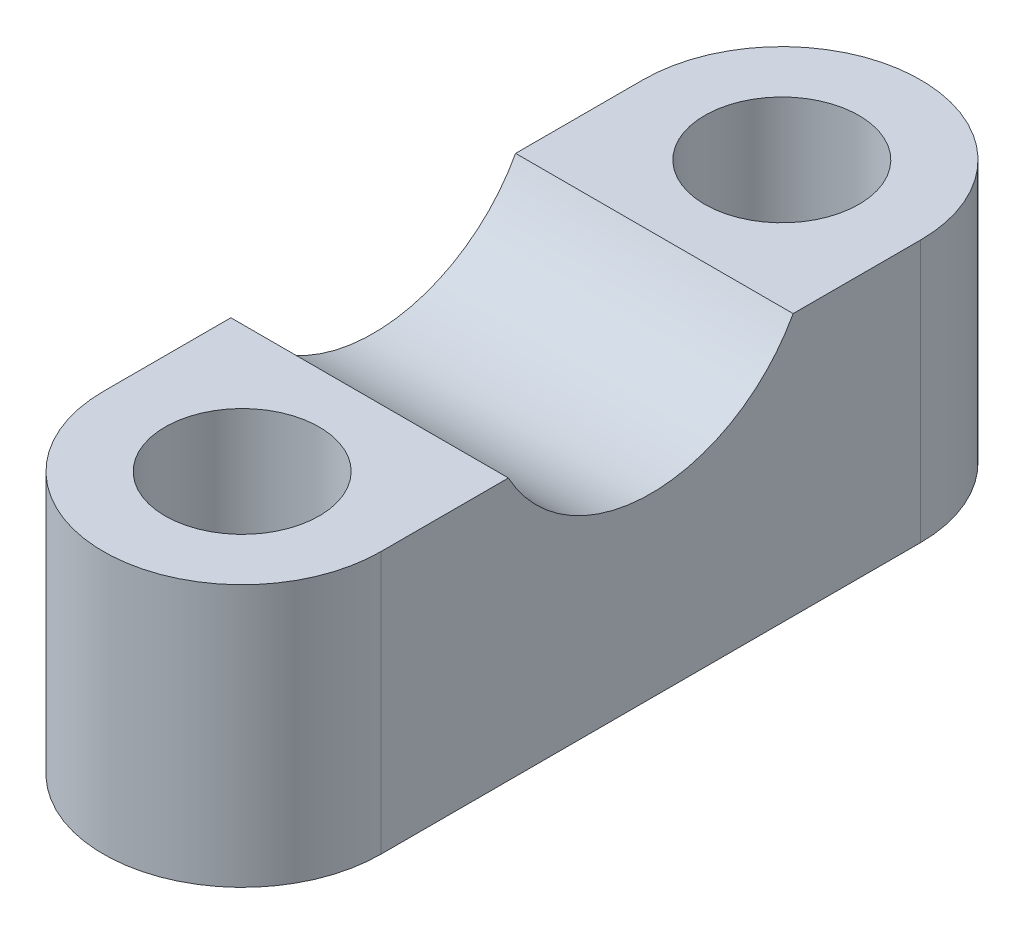
ISO-10303-21;
HEADER;
FILE_DESCRIPTION(('STEP AP214'),'2;1');
FILE_NAME('part.step','',(''),(''),'','','');
FILE_SCHEMA(('AUTOMOTIVE_DESIGN { 1 0 10303 214 1 1 1 1 }'));
ENDSEC;
DATA;
#1=APPLICATION_CONTEXT('core data for automotive mechanical design processes');
#2=APPLICATION_PROTOCOL_DEFINITION('international standard','automotive_design',2000,#1);
#3=PRODUCT_CONTEXT('',#1,'mechanical');
#4=PRODUCT('Part','Part','',(#3));
#5=PRODUCT_RELATED_PRODUCT_CATEGORY('part','',(#4));
#6=PRODUCT_DEFINITION_FORMATION('','',#4);
#7=PRODUCT_DEFINITION_CONTEXT('part definition',#1,'design');
#8=PRODUCT_DEFINITION('design','',#6,#7);
#9=PRODUCT_DEFINITION_SHAPE('','',#8);
#10=(LENGTH_UNIT() NAMED_UNIT(*) SI_UNIT(.MILLI.,.METRE.));
#11=(NAMED_UNIT(*) PLANE_ANGLE_UNIT() SI_UNIT($,.RADIAN.));
#12=(NAMED_UNIT(*) SI_UNIT($,.STERADIAN.) SOLID_ANGLE_UNIT());
#13=UNCERTAINTY_MEASURE_WITH_UNIT(LENGTH_MEASURE(1.E-05),#10,'distance_accuracy_value','');
#14=(GEOMETRIC_REPRESENTATION_CONTEXT(3) GLOBAL_UNCERTAINTY_ASSIGNED_CONTEXT((#13)) GLOBAL_UNIT_ASSIGNED_CONTEXT((#10,
#11,#12)) REPRESENTATION_CONTEXT('',''));
#15=CARTESIAN_POINT('',(0.,0.,0.));
#16=DIRECTION('',(0.,0.,1.));
#17=DIRECTION('',(1.,0.,0.));
#18=AXIS2_PLACEMENT_3D('',#15,#16,#17);
#19=CARTESIAN_POINT('',(-47.,17.,0.));
#20=DIRECTION('',(0.,1.,0.));
#21=DIRECTION('',(0.,0.,1.));
#22=AXIS2_PLACEMENT_3D('',#19,#20,#21);
#23=PLANE('',#22);
#24=DIRECTION('',(1.,0.,0.));
#25=VECTOR('',#24,1.);
#26=CARTESIAN_POINT('',(-64.,17.,-8.26690734369031));
#27=LINE('',#26,#25);
#28=CARTESIAN_POINT('',(-56.,17.,-8.26690734369031));
#29=VERTEX_POINT('',#28);
#30=CARTESIAN_POINT('',(-38.,17.,-8.26690734369031));
#31=VERTEX_POINT('',#30);
#32=EDGE_CURVE('E150',#29,#31,#27,.T.);
#33=ORIENTED_EDGE('',*,*,#32,.F.);
#34=DIRECTION('',(0.,0.,1.));
#35=VECTOR('',#34,1.);
#36=CARTESIAN_POINT('',(-56.,17.,0.));
#37=LINE('',#36,#35);
#38=CARTESIAN_POINT('',(-56.,17.,0.));
#39=VERTEX_POINT('',#38);
#40=EDGE_CURVE('E178',#29,#39,#37,.T.);
#41=ORIENTED_EDGE('',*,*,#40,.T.);
#42=CARTESIAN_POINT('',(-47.,17.,0.));
#43=DIRECTION('',(0.,1.,0.));
#44=DIRECTION('',(0.,0.,1.));
#45=AXIS2_PLACEMENT_3D('',#42,#43,#44);
#46=CIRCLE('',#45,9.);
#47=CARTESIAN_POINT('',(-38.,17.,0.));
#48=VERTEX_POINT('',#47);
#49=EDGE_CURVE('E168',#39,#48,#46,.T.);
#50=ORIENTED_EDGE('',*,*,#49,.T.);
#51=DIRECTION('',(0.,0.,-1.));
#52=VECTOR('',#51,1.);
#53=CARTESIAN_POINT('',(-38.,17.,0.));
#54=LINE('',#53,#52);
#55=EDGE_CURVE('E173',#48,#31,#54,.T.);
#56=ORIENTED_EDGE('',*,*,#55,.T.);
#57=EDGE_LOOP('',(#33,#41,#50,#56));
#58=FACE_BOUND('',#57,.T.);
#59=CARTESIAN_POINT('',(-47.,17.,0.));
#60=DIRECTION('',(0.,1.,0.));
#61=DIRECTION('',(0.,0.,1.));
#62=AXIS2_PLACEMENT_3D('',#59,#60,#61);
#63=CIRCLE('',#62,5.);
#64=CARTESIAN_POINT('',(-47.,17.,5.));
#65=VERTEX_POINT('',#64);
#66=EDGE_CURVE('E156',#65,#65,#63,.T.);
#67=ORIENTED_EDGE('',*,*,#66,.F.);
#68=EDGE_LOOP('',(#67));
#69=FACE_BOUND('',#68,.T.);
#70=ADVANCED_FACE('F35',(#58,#69),#23,.T.);
#71=DIRECTION('',(1.,0.,0.));
#72=VECTOR('',#71,1.);
#73=CARTESIAN_POINT('',(-64.,17.,-26.7330926563097));
#74=LINE('',#73,#72);
#75=CARTESIAN_POINT('',(-38.,17.,-26.7330926563097));
#76=VERTEX_POINT('',#75);
#77=CARTESIAN_POINT('',(-56.0000000000001,17.,-26.7330926563097));
#78=VERTEX_POINT('',#77);
#79=EDGE_CURVE('E58',#76,#78,#74,.F.);
#80=ORIENTED_EDGE('',*,*,#79,.F.);
#81=CARTESIAN_POINT('',(-38.0000000000001,17.,-35.));
#82=VERTEX_POINT('',#81);
#83=EDGE_CURVE('E171',#76,#82,#54,.T.);
#84=ORIENTED_EDGE('',*,*,#83,.T.);
#85=CARTESIAN_POINT('',(-47.0000000000001,17.,-35.));
#86=DIRECTION('',(0.,1.,0.));
#87=DIRECTION('',(0.,0.,1.));
#88=AXIS2_PLACEMENT_3D('',#85,#86,#87);
#89=CIRCLE('',#88,9.);
#90=CARTESIAN_POINT('',(-56.0000000000001,17.,-35.));
#91=VERTEX_POINT('',#90);
#92=EDGE_CURVE('E176',#82,#91,#89,.T.);
#93=ORIENTED_EDGE('',*,*,#92,.T.);
#94=EDGE_CURVE('E179',#91,#78,#37,.T.);
#95=ORIENTED_EDGE('',*,*,#94,.T.);
#96=EDGE_LOOP('',(#80,#84,#93,#95));
#97=FACE_BOUND('',#96,.T.);
#98=CARTESIAN_POINT('',(-47.0000000000001,17.,-35.));
#99=DIRECTION('',(0.,1.,0.));
#100=DIRECTION('',(0.,0.,1.));
#101=AXIS2_PLACEMENT_3D('',#98,#99,#100);
#102=CIRCLE('',#101,5.);
#103=CARTESIAN_POINT('',(-47.0000000000001,17.,-30.));
#104=VERTEX_POINT('',#103);
#105=EDGE_CURVE('E162',#104,#104,#102,.T.);
#106=ORIENTED_EDGE('',*,*,#105,.F.);
#107=EDGE_LOOP('',(#106));
#108=FACE_BOUND('',#107,.T.);
#109=ADVANCED_FACE('F221',(#97,#108),#23,.T.);
#110=CARTESIAN_POINT('',(-47.,0.,0.));
#111=DIRECTION('',(0.,1.,0.));
#112=DIRECTION('',(0.,0.,1.));
#113=AXIS2_PLACEMENT_3D('',#110,#111,#112);
#114=PLANE('',#113);
#115=DIRECTION('',(0.,0.,1.));
#116=VECTOR('',#115,1.);
#117=CARTESIAN_POINT('',(-41.9999999999999,0.,-7.48331477354782));
#118=LINE('',#117,#116);
#119=CARTESIAN_POINT('',(-42.0000000000001,0.,-27.5166852264521));
#120=VERTEX_POINT('',#119);
#121=CARTESIAN_POINT('',(-41.9999999999999,0.,-7.48331477354783));
#122=VERTEX_POINT('',#121);
#123=EDGE_CURVE('E140',#120,#122,#118,.T.);
#124=ORIENTED_EDGE('',*,*,#123,.F.);
#125=CARTESIAN_POINT('',(-47.0000000000001,0.,-35.));
#126=DIRECTION('',(0.,1.,0.));
#127=DIRECTION('',(0.,0.,-1.));
#128=AXIS2_PLACEMENT_3D('',#125,#126,#127);
#129=CIRCLE('',#128,9.00000000000001);
#130=CARTESIAN_POINT('',(-52.0000000000001,0.,-27.5166852264521));
#131=VERTEX_POINT('',#130);
#132=EDGE_CURVE('E50',#131,#120,#129,.T.);
#133=ORIENTED_EDGE('',*,*,#132,.F.);
#134=DIRECTION('',(0.,0.,-1.));
#135=VECTOR('',#134,1.);
#136=CARTESIAN_POINT('',(-52.0000000000001,0.,-7.4833147735478));
#137=LINE('',#136,#135);
#138=CARTESIAN_POINT('',(-52.0000000000001,0.,-7.4833147735478));
#139=VERTEX_POINT('',#138);
#140=EDGE_CURVE('E131',#139,#131,#137,.T.);
#141=ORIENTED_EDGE('',*,*,#140,.F.);
#142=CARTESIAN_POINT('',(-47.,0.,0.));
#143=DIRECTION('',(0.,1.,0.));
#144=DIRECTION('',(0.,0.,-1.));
#145=AXIS2_PLACEMENT_3D('',#142,#143,#144);
#146=CIRCLE('',#145,9.);
#147=EDGE_CURVE('E134',#122,#139,#146,.T.);
#148=ORIENTED_EDGE('',*,*,#147,.F.);
#149=EDGE_LOOP('',(#124,#133,#141,#148));
#150=FACE_BOUND('',#149,.T.);
#151=CARTESIAN_POINT('',(-47.,0.,0.));
#152=DIRECTION('',(0.,1.,0.));
#153=DIRECTION('',(0.,0.,1.));
#154=AXIS2_PLACEMENT_3D('',#151,#152,#153);
#155=CIRCLE('',#154,9.);
#156=CARTESIAN_POINT('',(-56.,0.,0.));
#157=VERTEX_POINT('',#156);
#158=CARTESIAN_POINT('',(-38.,0.,0.));
#159=VERTEX_POINT('',#158);
#160=EDGE_CURVE('E165',#157,#159,#155,.T.);
#161=ORIENTED_EDGE('',*,*,#160,.F.);
#162=DIRECTION('',(0.,0.,1.));
#163=VECTOR('',#162,1.);
#164=CARTESIAN_POINT('',(-56.,0.,0.));
#165=LINE('',#164,#163);
#166=CARTESIAN_POINT('',(-56.0000000000001,0.,-35.));
#167=VERTEX_POINT('',#166);
#168=EDGE_CURVE('E172',#167,#157,#165,.T.);
#169=ORIENTED_EDGE('',*,*,#168,.F.);
#170=CARTESIAN_POINT('',(-47.0000000000001,0.,-35.));
#171=DIRECTION('',(0.,1.,0.));
#172=DIRECTION('',(0.,0.,1.));
#173=AXIS2_PLACEMENT_3D('',#170,#171,#172);
#174=CIRCLE('',#173,9.);
#175=CARTESIAN_POINT('',(-38.0000000000001,0.,-35.));
#176=VERTEX_POINT('',#175);
#177=EDGE_CURVE('E187',#176,#167,#174,.T.);
#178=ORIENTED_EDGE('',*,*,#177,.F.);
#179=DIRECTION('',(0.,0.,-1.));
#180=VECTOR('',#179,1.);
#181=CARTESIAN_POINT('',(-38.,0.,0.));
#182=LINE('',#181,#180);
#183=EDGE_CURVE('E185',#159,#176,#182,.T.);
#184=ORIENTED_EDGE('',*,*,#183,.F.);
#185=EDGE_LOOP('',(#161,#169,#178,#184));
#186=FACE_BOUND('',#185,.T.);
#187=CARTESIAN_POINT('',(-47.0000000000001,0.,-35.));
#188=DIRECTION('',(0.,1.,0.));
#189=DIRECTION('',(0.,0.,1.));
#190=AXIS2_PLACEMENT_3D('',#187,#188,#189);
#191=CIRCLE('',#190,5.);
#192=CARTESIAN_POINT('',(-47.0000000000001,0.,-30.));
#193=VERTEX_POINT('',#192);
#194=EDGE_CURVE('E159',#193,#193,#191,.T.);
#195=ORIENTED_EDGE('',*,*,#194,.T.);
#196=EDGE_LOOP('',(#195));
#197=FACE_BOUND('',#196,.T.);
#198=CARTESIAN_POINT('',(-47.,0.,0.));
#199=DIRECTION('',(0.,1.,0.));
#200=DIRECTION('',(0.,0.,1.));
#201=AXIS2_PLACEMENT_3D('',#198,#199,#200);
#202=CIRCLE('',#201,5.);
#203=CARTESIAN_POINT('',(-47.,0.,5.));
#204=VERTEX_POINT('',#203);
#205=EDGE_CURVE('E155',#204,#204,#202,.T.);
#206=ORIENTED_EDGE('',*,*,#205,.T.);
#207=EDGE_LOOP('',(#206));
#208=FACE_BOUND('',#207,.T.);
#209=ADVANCED_FACE('F209',(#150,#186,#197,#208),#114,.F.);
#210=CARTESIAN_POINT('',(-47.,17.,0.));
#211=DIRECTION('',(0.,-1.,0.));
#212=DIRECTION('',(0.,0.,-1.));
#213=AXIS2_PLACEMENT_3D('',#210,#211,#212);
#214=CYLINDRICAL_SURFACE('',#213,9.);
#215=ORIENTED_EDGE('',*,*,#160,.T.);
#216=DIRECTION('',(0.,-1.,0.));
#217=VECTOR('',#216,1.);
#218=CARTESIAN_POINT('',(-38.,17.,0.));
#219=LINE('',#218,#217);
#220=EDGE_CURVE('E43',#48,#159,#219,.T.);
#221=ORIENTED_EDGE('',*,*,#220,.F.);
#222=ORIENTED_EDGE('',*,*,#49,.F.);
#223=DIRECTION('',(0.,-1.,0.));
#224=VECTOR('',#223,1.);
#225=CARTESIAN_POINT('',(-56.,17.,0.));
#226=LINE('',#225,#224);
#227=EDGE_CURVE('E182',#39,#157,#226,.T.);
#228=ORIENTED_EDGE('',*,*,#227,.T.);
#229=EDGE_LOOP('',(#215,#221,#222,#228));
#230=FACE_BOUND('',#229,.T.);
#231=ADVANCED_FACE('F37',(#230),#214,.T.);
#232=CARTESIAN_POINT('',(-38.,17.,0.));
#233=DIRECTION('',(-1.,0.,0.));
#234=DIRECTION('',(0.,0.,1.));
#235=AXIS2_PLACEMENT_3D('',#232,#233,#234);
#236=PLANE('',#235);
#237=ORIENTED_EDGE('',*,*,#83,.F.);
#238=CARTESIAN_POINT('',(-38.0000000000001,22.,-17.5));
#239=DIRECTION('',(-1.,0.,0.));
#240=DIRECTION('',(0.,0.,1.));
#241=AXIS2_PLACEMENT_3D('',#238,#239,#240);
#242=CIRCLE('',#241,10.5);
#243=EDGE_CURVE('E152',#76,#31,#242,.T.);
#244=ORIENTED_EDGE('',*,*,#243,.T.);
#245=ORIENTED_EDGE('',*,*,#55,.F.);
#246=ORIENTED_EDGE('',*,*,#220,.T.);
#247=ORIENTED_EDGE('',*,*,#183,.T.);
#248=DIRECTION('',(0.,-1.,0.));
#249=VECTOR('',#248,1.);
#250=CARTESIAN_POINT('',(-38.0000000000001,17.,-35.));
#251=LINE('',#250,#249);
#252=EDGE_CURVE('E195',#82,#176,#251,.T.);
#253=ORIENTED_EDGE('',*,*,#252,.F.);
#254=EDGE_LOOP('',(#237,#244,#245,#246,#247,#253));
#255=FACE_BOUND('',#254,.T.);
#256=ADVANCED_FACE('F201',(#255),#236,.F.);
#257=CARTESIAN_POINT('',(-47.0000000000001,17.,-35.));
#258=DIRECTION('',(0.,-1.,0.));
#259=DIRECTION('',(0.,0.,-1.));
#260=AXIS2_PLACEMENT_3D('',#257,#258,#259);
#261=CYLINDRICAL_SURFACE('',#260,9.);
#262=ORIENTED_EDGE('',*,*,#177,.T.);
#263=DIRECTION('',(0.,-1.,0.));
#264=VECTOR('',#263,1.);
#265=CARTESIAN_POINT('',(-56.0000000000001,17.,-35.));
#266=LINE('',#265,#264);
#267=EDGE_CURVE('E192',#91,#167,#266,.T.);
#268=ORIENTED_EDGE('',*,*,#267,.F.);
#269=ORIENTED_EDGE('',*,*,#92,.F.);
#270=ORIENTED_EDGE('',*,*,#252,.T.);
#271=EDGE_LOOP('',(#262,#268,#269,#270));
#272=FACE_BOUND('',#271,.T.);
#273=ADVANCED_FACE('F214',(#272),#261,.T.);
#274=CARTESIAN_POINT('',(-56.,17.,0.));
#275=DIRECTION('',(1.,0.,0.));
#276=DIRECTION('',(0.,0.,-1.));
#277=AXIS2_PLACEMENT_3D('',#274,#275,#276);
#278=PLANE('',#277);
#279=ORIENTED_EDGE('',*,*,#40,.F.);
#280=CARTESIAN_POINT('',(-56.0000000000001,22.,-17.5));
#281=DIRECTION('',(1.,0.,0.));
#282=DIRECTION('',(0.,0.,-1.));
#283=AXIS2_PLACEMENT_3D('',#280,#281,#282);
#284=CIRCLE('',#283,10.5);
#285=EDGE_CURVE('E11',#29,#78,#284,.T.);
#286=ORIENTED_EDGE('',*,*,#285,.T.);
#287=ORIENTED_EDGE('',*,*,#94,.F.);
#288=ORIENTED_EDGE('',*,*,#267,.T.);
#289=ORIENTED_EDGE('',*,*,#168,.T.);
#290=ORIENTED_EDGE('',*,*,#227,.F.);
#291=EDGE_LOOP('',(#279,#286,#287,#288,#289,#290));
#292=FACE_BOUND('',#291,.T.);
#293=ADVANCED_FACE('F219',(#292),#278,.F.);
#294=CARTESIAN_POINT('',(-47.0000000000001,17.,-35.));
#295=DIRECTION('',(0.,-1.,0.));
#296=DIRECTION('',(0.,0.,-1.));
#297=AXIS2_PLACEMENT_3D('',#294,#295,#296);
#298=CYLINDRICAL_SURFACE('',#297,5.);
#299=ORIENTED_EDGE('',*,*,#105,.T.);
#300=EDGE_LOOP('',(#299));
#301=FACE_BOUND('',#300,.T.);
#302=ORIENTED_EDGE('',*,*,#194,.F.);
#303=EDGE_LOOP('',(#302));
#304=FACE_BOUND('',#303,.T.);
#305=ADVANCED_FACE('F236',(#301,#304),#298,.F.);
#306=CARTESIAN_POINT('',(-47.,17.,0.));
#307=DIRECTION('',(0.,-1.,0.));
#308=DIRECTION('',(0.,0.,-1.));
#309=AXIS2_PLACEMENT_3D('',#306,#307,#308);
#310=CYLINDRICAL_SURFACE('',#309,5.);
#311=ORIENTED_EDGE('',*,*,#66,.T.);
#312=EDGE_LOOP('',(#311));
#313=FACE_BOUND('',#312,.T.);
#314=ORIENTED_EDGE('',*,*,#205,.F.);
#315=EDGE_LOOP('',(#314));
#316=FACE_BOUND('',#315,.T.);
#317=ADVANCED_FACE('F228',(#313,#316),#310,.F.);
#318=CARTESIAN_POINT('',(-64.,22.,-17.5));
#319=DIRECTION('',(1.,0.,0.));
#320=DIRECTION('',(0.,0.,-1.));
#321=AXIS2_PLACEMENT_3D('',#318,#319,#320);
#322=CYLINDRICAL_SURFACE('',#321,10.5);
#323=ORIENTED_EDGE('',*,*,#79,.T.);
#324=ORIENTED_EDGE('',*,*,#285,.F.);
#325=ORIENTED_EDGE('',*,*,#32,.T.);
#326=ORIENTED_EDGE('',*,*,#243,.F.);
#327=EDGE_LOOP('',(#323,#324,#325,#326));
#328=FACE_BOUND('',#327,.T.);
#329=ADVANCED_FACE('F226',(#328),#322,.F.);
#330=CARTESIAN_POINT('',(-47.0000000000001,8.,-35.));
#331=DIRECTION('',(0.,-1.,0.));
#332=DIRECTION('',(0.,0.,-1.));
#333=AXIS2_PLACEMENT_3D('',#330,#331,#332);
#334=CYLINDRICAL_SURFACE('',#333,9.00000000000001);
#335=ORIENTED_EDGE('',*,*,#132,.T.);
#336=DIRECTION('',(0.,-1.,0.));
#337=VECTOR('',#336,1.);
#338=CARTESIAN_POINT('',(-42.0000000000001,8.,-27.5166852264521));
#339=LINE('',#338,#337);
#340=CARTESIAN_POINT('',(-42.0000000000001,8.,-27.5166852264521));
#341=VERTEX_POINT('',#340);
#342=EDGE_CURVE('E109',#341,#120,#339,.T.);
#343=ORIENTED_EDGE('',*,*,#342,.F.);
#344=CARTESIAN_POINT('',(-47.0000000000001,8.,-35.));
#345=DIRECTION('',(0.,1.,0.));
#346=DIRECTION('',(0.,0.,-1.));
#347=AXIS2_PLACEMENT_3D('',#344,#345,#346);
#348=CIRCLE('',#347,9.00000000000001);
#349=CARTESIAN_POINT('',(-52.0000000000001,8.,-27.5166852264521));
#350=VERTEX_POINT('',#349);
#351=EDGE_CURVE('E113',#350,#341,#348,.T.);
#352=ORIENTED_EDGE('',*,*,#351,.F.);
#353=DIRECTION('',(0.,-1.,0.));
#354=VECTOR('',#353,1.);
#355=CARTESIAN_POINT('',(-52.0000000000001,8.,-27.5166852264521));
#356=LINE('',#355,#354);
#357=EDGE_CURVE('E144',#350,#131,#356,.T.);
#358=ORIENTED_EDGE('',*,*,#357,.T.);
#359=EDGE_LOOP('',(#335,#343,#352,#358));
#360=FACE_BOUND('',#359,.T.);
#361=ADVANCED_FACE('F111',(#360),#334,.T.);
#362=CARTESIAN_POINT('',(-52.0000000000001,8.,-7.4833147735478));
#363=DIRECTION('',(-1.,0.,0.));
#364=DIRECTION('',(0.,0.,1.));
#365=AXIS2_PLACEMENT_3D('',#362,#363,#364);
#366=PLANE('',#365);
#367=ORIENTED_EDGE('',*,*,#140,.T.);
#368=ORIENTED_EDGE('',*,*,#357,.F.);
#369=DIRECTION('',(0.,0.,-1.));
#370=VECTOR('',#369,1.);
#371=CARTESIAN_POINT('',(-52.0000000000001,8.,-7.4833147735478));
#372=LINE('',#371,#370);
#373=CARTESIAN_POINT('',(-52.0000000000001,8.,-7.4833147735478));
#374=VERTEX_POINT('',#373);
#375=EDGE_CURVE('E119',#374,#350,#372,.T.);
#376=ORIENTED_EDGE('',*,*,#375,.F.);
#377=DIRECTION('',(0.,-1.,0.));
#378=VECTOR('',#377,1.);
#379=CARTESIAN_POINT('',(-52.0000000000001,8.,-7.4833147735478));
#380=LINE('',#379,#378);
#381=EDGE_CURVE('E146',#374,#139,#380,.T.);
#382=ORIENTED_EDGE('',*,*,#381,.T.);
#383=EDGE_LOOP('',(#367,#368,#376,#382));
#384=FACE_BOUND('',#383,.T.);
#385=ADVANCED_FACE('F234',(#384),#366,.F.);
#386=CARTESIAN_POINT('',(-47.,8.,0.));
#387=DIRECTION('',(0.,-1.,0.));
#388=DIRECTION('',(0.,0.,-1.));
#389=AXIS2_PLACEMENT_3D('',#386,#387,#388);
#390=CYLINDRICAL_SURFACE('',#389,9.);
#391=ORIENTED_EDGE('',*,*,#147,.T.);
#392=ORIENTED_EDGE('',*,*,#381,.F.);
#393=CARTESIAN_POINT('',(-47.,8.,0.));
#394=DIRECTION('',(0.,1.,0.));
#395=DIRECTION('',(0.,0.,-1.));
#396=AXIS2_PLACEMENT_3D('',#393,#394,#395);
#397=CIRCLE('',#396,9.);
#398=CARTESIAN_POINT('',(-41.9999999999999,8.,-7.48331477354783));
#399=VERTEX_POINT('',#398);
#400=EDGE_CURVE('E127',#399,#374,#397,.T.);
#401=ORIENTED_EDGE('',*,*,#400,.F.);
#402=DIRECTION('',(0.,-1.,0.));
#403=VECTOR('',#402,1.);
#404=CARTESIAN_POINT('',(-41.9999999999999,8.,-7.48331477354783));
#405=LINE('',#404,#403);
#406=EDGE_CURVE('E118',#399,#122,#405,.T.);
#407=ORIENTED_EDGE('',*,*,#406,.T.);
#408=EDGE_LOOP('',(#391,#392,#401,#407));
#409=FACE_BOUND('',#408,.T.);
#410=ADVANCED_FACE('F305',(#409),#390,.T.);
#411=CARTESIAN_POINT('',(-41.9999999999999,8.,-7.48331477354782));
#412=DIRECTION('',(1.,0.,0.));
#413=DIRECTION('',(0.,0.,-1.));
#414=AXIS2_PLACEMENT_3D('',#411,#412,#413);
#415=PLANE('',#414);
#416=ORIENTED_EDGE('',*,*,#123,.T.);
#417=ORIENTED_EDGE('',*,*,#406,.F.);
#418=DIRECTION('',(0.,0.,1.));
#419=VECTOR('',#418,1.);
#420=CARTESIAN_POINT('',(-41.9999999999999,8.,-7.48331477354782));
#421=LINE('',#420,#419);
#422=EDGE_CURVE('E122',#341,#399,#421,.T.);
#423=ORIENTED_EDGE('',*,*,#422,.F.);
#424=ORIENTED_EDGE('',*,*,#342,.T.);
#425=EDGE_LOOP('',(#416,#417,#423,#424));
#426=FACE_BOUND('',#425,.T.);
#427=ADVANCED_FACE('F123',(#426),#415,.F.);
#428=CARTESIAN_POINT('',(-47.0000000000001,8.,-35.));
#429=DIRECTION('',(0.,-1.,0.));
#430=DIRECTION('',(0.,0.,-1.));
#431=AXIS2_PLACEMENT_3D('',#428,#429,#430);
#432=PLANE('',#431);
#433=ORIENTED_EDGE('',*,*,#351,.T.);
#434=ORIENTED_EDGE('',*,*,#422,.T.);
#435=ORIENTED_EDGE('',*,*,#400,.T.);
#436=ORIENTED_EDGE('',*,*,#375,.T.);
#437=EDGE_LOOP('',(#433,#434,#435,#436));
#438=FACE_BOUND('',#437,.T.);
#439=ADVANCED_FACE('F129',(#438),#432,.T.);
#440=CLOSED_SHELL('',(#70,#109,#209,#231,#256,#273,#293,#305,#317,#329,#361,#385,#410,#427,#439));
#441=MANIFOLD_SOLID_BREP('B2',#440);
#442=ADVANCED_BREP_SHAPE_REPRESENTATION('',(#18,#441),#14);
#443=SHAPE_DEFINITION_REPRESENTATION(#9,#442);
ENDSEC;
END-ISO-10303-21;
